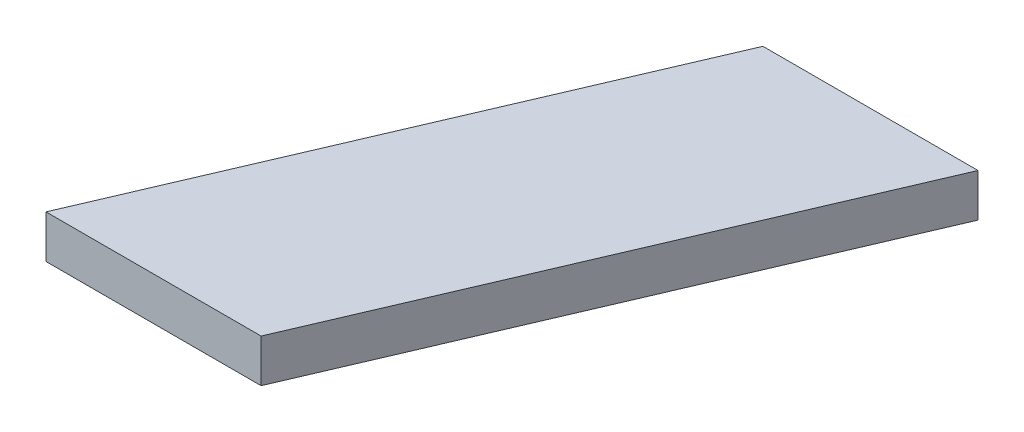
ISO-10303-21;
HEADER;
FILE_DESCRIPTION(('STEP AP214'),'2;1');
FILE_NAME('part.step','',(''),(''),'','','');
FILE_SCHEMA(('AUTOMOTIVE_DESIGN { 1 0 10303 214 1 1 1 1 }'));
ENDSEC;
DATA;
#1=APPLICATION_CONTEXT('core data for automotive mechanical design processes');
#2=APPLICATION_PROTOCOL_DEFINITION('international standard','automotive_design',2000,#1);
#3=PRODUCT_CONTEXT('',#1,'mechanical');
#4=PRODUCT('Part','Part','',(#3));
#5=PRODUCT_RELATED_PRODUCT_CATEGORY('part','',(#4));
#6=PRODUCT_DEFINITION_FORMATION('','',#4);
#7=PRODUCT_DEFINITION_CONTEXT('part definition',#1,'design');
#8=PRODUCT_DEFINITION('design','',#6,#7);
#9=PRODUCT_DEFINITION_SHAPE('','',#8);
#10=(LENGTH_UNIT() NAMED_UNIT(*) SI_UNIT(.MILLI.,.METRE.));
#11=(NAMED_UNIT(*) PLANE_ANGLE_UNIT() SI_UNIT($,.RADIAN.));
#12=(NAMED_UNIT(*) SI_UNIT($,.STERADIAN.) SOLID_ANGLE_UNIT());
#13=UNCERTAINTY_MEASURE_WITH_UNIT(LENGTH_MEASURE(1.E-05),#10,'distance_accuracy_value','');
#14=(GEOMETRIC_REPRESENTATION_CONTEXT(3) GLOBAL_UNCERTAINTY_ASSIGNED_CONTEXT((#13)) GLOBAL_UNIT_ASSIGNED_CONTEXT((#10,
#11,#12)) REPRESENTATION_CONTEXT('',''));
#15=CARTESIAN_POINT('',(0.,0.,0.));
#16=DIRECTION('',(0.,0.,1.));
#17=DIRECTION('',(1.,0.,0.));
#18=AXIS2_PLACEMENT_3D('',#15,#16,#17);
#19=CARTESIAN_POINT('',(1.5,0.3,-3.5));
#20=DIRECTION('',(-0.919145030018058,0.,-0.393919298579168));
#21=DIRECTION('',(-0.393919298579168,0.,0.919145030018058));
#22=AXIS2_PLACEMENT_3D('',#19,#20,#21);
#23=PLANE('',#22);
#24=DIRECTION('',(0.393919298579168,0.,-0.919145030018058));
#25=VECTOR('',#24,1.);
#26=CARTESIAN_POINT('',(1.5,0.,-3.5));
#27=LINE('',#26,#25);
#28=CARTESIAN_POINT('',(0.,0.,0.));
#29=VERTEX_POINT('',#28);
#30=CARTESIAN_POINT('',(1.5,0.,-3.5));
#31=VERTEX_POINT('',#30);
#32=EDGE_CURVE('E111',#29,#31,#27,.T.);
#33=ORIENTED_EDGE('',*,*,#32,.T.);
#34=DIRECTION('',(0.,-1.,0.));
#35=VECTOR('',#34,1.);
#36=CARTESIAN_POINT('',(1.5,0.3,-3.5));
#37=LINE('',#36,#35);
#38=CARTESIAN_POINT('',(1.5,0.3,-3.5));
#39=VERTEX_POINT('',#38);
#40=EDGE_CURVE('E11',#39,#31,#37,.T.);
#41=ORIENTED_EDGE('',*,*,#40,.F.);
#42=DIRECTION('',(0.393919298579168,0.,-0.919145030018058));
#43=VECTOR('',#42,1.);
#44=CARTESIAN_POINT('',(1.5,0.3,-3.5));
#45=LINE('',#44,#43);
#46=CARTESIAN_POINT('',(0.,0.3,0.));
#47=VERTEX_POINT('',#46);
#48=EDGE_CURVE('E94',#47,#39,#45,.T.);
#49=ORIENTED_EDGE('',*,*,#48,.F.);
#50=DIRECTION('',(0.,-1.,0.));
#51=VECTOR('',#50,1.);
#52=CARTESIAN_POINT('',(0.,0.3,0.));
#53=LINE('',#52,#51);
#54=EDGE_CURVE('E107',#47,#29,#53,.T.);
#55=ORIENTED_EDGE('',*,*,#54,.T.);
#56=EDGE_LOOP('',(#33,#41,#49,#55));
#57=FACE_BOUND('',#56,.T.);
#58=ADVANCED_FACE('F37',(#57),#23,.F.);
#59=CARTESIAN_POINT('',(1.5,0.3,-3.5));
#60=DIRECTION('',(0.,0.,1.));
#61=DIRECTION('',(1.,0.,0.));
#62=AXIS2_PLACEMENT_3D('',#59,#60,#61);
#63=PLANE('',#62);
#64=DIRECTION('',(-1.,0.,0.));
#65=VECTOR('',#64,1.);
#66=CARTESIAN_POINT('',(1.5,0.,-3.5));
#67=LINE('',#66,#65);
#68=CARTESIAN_POINT('',(0.,0.,-3.5));
#69=VERTEX_POINT('',#68);
#70=EDGE_CURVE('E99',#31,#69,#67,.T.);
#71=ORIENTED_EDGE('',*,*,#70,.T.);
#72=DIRECTION('',(0.,-1.,0.));
#73=VECTOR('',#72,1.);
#74=CARTESIAN_POINT('',(0.,0.3,-3.5));
#75=LINE('',#74,#73);
#76=CARTESIAN_POINT('',(0.,0.3,-3.5));
#77=VERTEX_POINT('',#76);
#78=EDGE_CURVE('E46',#77,#69,#75,.T.);
#79=ORIENTED_EDGE('',*,*,#78,.F.);
#80=DIRECTION('',(-1.,0.,0.));
#81=VECTOR('',#80,1.);
#82=CARTESIAN_POINT('',(1.5,0.3,-3.5));
#83=LINE('',#82,#81);
#84=EDGE_CURVE('E89',#39,#77,#83,.T.);
#85=ORIENTED_EDGE('',*,*,#84,.F.);
#86=ORIENTED_EDGE('',*,*,#40,.T.);
#87=EDGE_LOOP('',(#71,#79,#85,#86));
#88=FACE_BOUND('',#87,.T.);
#89=ADVANCED_FACE('F98',(#88),#63,.F.);
#90=CARTESIAN_POINT('',(0.,0.3,-3.5));
#91=DIRECTION('',(0.919145030018058,0.,0.393919298579168));
#92=DIRECTION('',(0.393919298579168,0.,-0.919145030018058));
#93=AXIS2_PLACEMENT_3D('',#90,#91,#92);
#94=PLANE('',#93);
#95=DIRECTION('',(-0.393919298579168,0.,0.919145030018058));
#96=VECTOR('',#95,1.);
#97=CARTESIAN_POINT('',(0.,0.,-3.5));
#98=LINE('',#97,#96);
#99=CARTESIAN_POINT('',(-1.5,0.,0.));
#100=VERTEX_POINT('',#99);
#101=EDGE_CURVE('E75',#69,#100,#98,.T.);
#102=ORIENTED_EDGE('',*,*,#101,.T.);
#103=DIRECTION('',(0.,-1.,0.));
#104=VECTOR('',#103,1.);
#105=CARTESIAN_POINT('',(-1.5,0.3,0.));
#106=LINE('',#105,#104);
#107=CARTESIAN_POINT('',(-1.5,0.3,0.));
#108=VERTEX_POINT('',#107);
#109=EDGE_CURVE('E101',#108,#100,#106,.T.);
#110=ORIENTED_EDGE('',*,*,#109,.F.);
#111=DIRECTION('',(-0.393919298579168,0.,0.919145030018058));
#112=VECTOR('',#111,1.);
#113=CARTESIAN_POINT('',(0.,0.3,-3.5));
#114=LINE('',#113,#112);
#115=EDGE_CURVE('E92',#77,#108,#114,.T.);
#116=ORIENTED_EDGE('',*,*,#115,.F.);
#117=ORIENTED_EDGE('',*,*,#78,.T.);
#118=EDGE_LOOP('',(#102,#110,#116,#117));
#119=FACE_BOUND('',#118,.T.);
#120=ADVANCED_FACE('F102',(#119),#94,.F.);
#121=CARTESIAN_POINT('',(-1.5,0.3,0.));
#122=DIRECTION('',(0.,0.,-1.));
#123=DIRECTION('',(-1.,0.,0.));
#124=AXIS2_PLACEMENT_3D('',#121,#122,#123);
#125=PLANE('',#124);
#126=DIRECTION('',(1.,0.,0.));
#127=VECTOR('',#126,1.);
#128=CARTESIAN_POINT('',(-1.5,0.,0.));
#129=LINE('',#128,#127);
#130=EDGE_CURVE('E81',#100,#29,#129,.T.);
#131=ORIENTED_EDGE('',*,*,#130,.T.);
#132=ORIENTED_EDGE('',*,*,#54,.F.);
#133=DIRECTION('',(1.,0.,0.));
#134=VECTOR('',#133,1.);
#135=CARTESIAN_POINT('',(-1.5,0.3,0.));
#136=LINE('',#135,#134);
#137=EDGE_CURVE('E57',#108,#47,#136,.T.);
#138=ORIENTED_EDGE('',*,*,#137,.F.);
#139=ORIENTED_EDGE('',*,*,#109,.T.);
#140=EDGE_LOOP('',(#131,#132,#138,#139));
#141=FACE_BOUND('',#140,.T.);
#142=ADVANCED_FACE('F121',(#141),#125,.F.);
#143=CARTESIAN_POINT('',(0.,0.3,0.));
#144=DIRECTION('',(0.,1.,0.));
#145=DIRECTION('',(0.,0.,1.));
#146=AXIS2_PLACEMENT_3D('',#143,#144,#145);
#147=PLANE('',#146);
#148=ORIENTED_EDGE('',*,*,#48,.T.);
#149=ORIENTED_EDGE('',*,*,#84,.T.);
#150=ORIENTED_EDGE('',*,*,#115,.T.);
#151=ORIENTED_EDGE('',*,*,#137,.T.);
#152=EDGE_LOOP('',(#148,#149,#150,#151));
#153=FACE_BOUND('',#152,.T.);
#154=ADVANCED_FACE('F90',(#153),#147,.T.);
#155=CARTESIAN_POINT('',(0.,0.,0.));
#156=DIRECTION('',(0.,1.,0.));
#157=DIRECTION('',(0.,0.,1.));
#158=AXIS2_PLACEMENT_3D('',#155,#156,#157);
#159=PLANE('',#158);
#160=ORIENTED_EDGE('',*,*,#32,.F.);
#161=ORIENTED_EDGE('',*,*,#130,.F.);
#162=ORIENTED_EDGE('',*,*,#101,.F.);
#163=ORIENTED_EDGE('',*,*,#70,.F.);
#164=EDGE_LOOP('',(#160,#161,#162,#163));
#165=FACE_BOUND('',#164,.T.);
#166=ADVANCED_FACE('F124',(#165),#159,.F.);
#167=CLOSED_SHELL('',(#58,#89,#120,#142,#154,#166));
#168=MANIFOLD_SOLID_BREP('B2',#167);
#169=ADVANCED_BREP_SHAPE_REPRESENTATION('',(#18,#168),#14);
#170=SHAPE_DEFINITION_REPRESENTATION(#9,#169);
ENDSEC;
END-ISO-10303-21;
